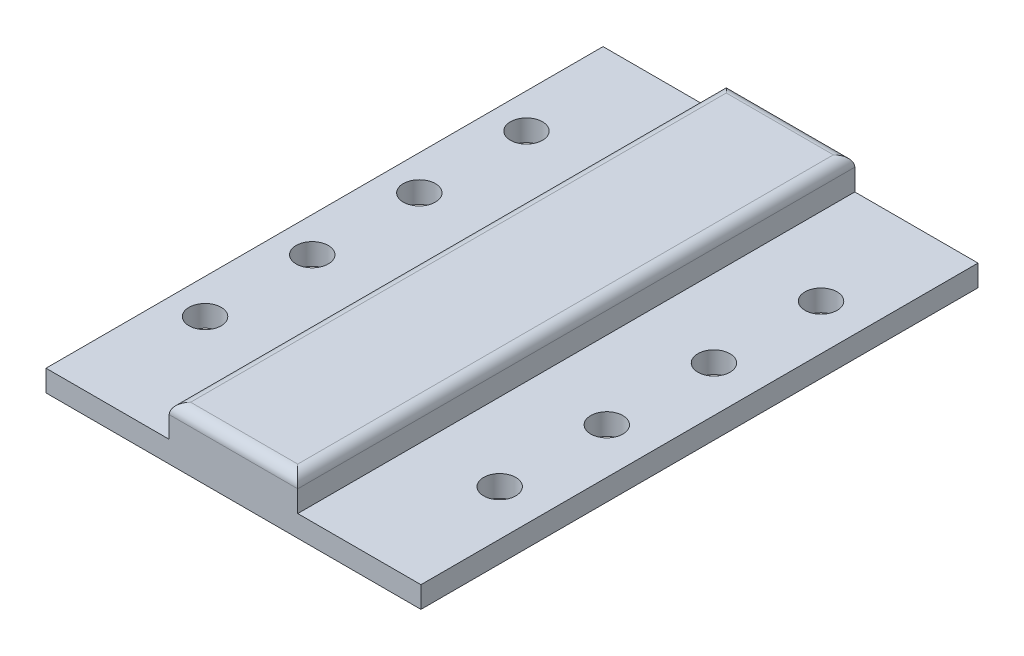
ISO-10303-21;
HEADER;
FILE_DESCRIPTION(('STEP AP214'),'2;1');
FILE_NAME('part.step','',(''),(''),'','','');
FILE_SCHEMA(('AUTOMOTIVE_DESIGN { 1 0 10303 214 1 1 1 1 }'));
ENDSEC;
DATA;
#1=APPLICATION_CONTEXT('core data for automotive mechanical design processes');
#2=APPLICATION_PROTOCOL_DEFINITION('international standard','automotive_design',2000,#1);
#3=PRODUCT_CONTEXT('',#1,'mechanical');
#4=PRODUCT('Part','Part','',(#3));
#5=PRODUCT_RELATED_PRODUCT_CATEGORY('part','',(#4));
#6=PRODUCT_DEFINITION_FORMATION('','',#4);
#7=PRODUCT_DEFINITION_CONTEXT('part definition',#1,'design');
#8=PRODUCT_DEFINITION('design','',#6,#7);
#9=PRODUCT_DEFINITION_SHAPE('','',#8);
#10=(LENGTH_UNIT() NAMED_UNIT(*) SI_UNIT(.MILLI.,.METRE.));
#11=(NAMED_UNIT(*) PLANE_ANGLE_UNIT() SI_UNIT($,.RADIAN.));
#12=(NAMED_UNIT(*) SI_UNIT($,.STERADIAN.) SOLID_ANGLE_UNIT());
#13=UNCERTAINTY_MEASURE_WITH_UNIT(LENGTH_MEASURE(1.E-05),#10,'distance_accuracy_value','');
#14=(GEOMETRIC_REPRESENTATION_CONTEXT(3) GLOBAL_UNCERTAINTY_ASSIGNED_CONTEXT((#13)) GLOBAL_UNIT_ASSIGNED_CONTEXT((#10,
#11,#12)) REPRESENTATION_CONTEXT('',''));
#15=CARTESIAN_POINT('',(0.,0.,0.));
#16=DIRECTION('',(0.,0.,1.));
#17=DIRECTION('',(1.,0.,0.));
#18=AXIS2_PLACEMENT_3D('',#15,#16,#17);
#19=CARTESIAN_POINT('',(0.,2.,0.));
#20=DIRECTION('',(0.,1.,0.));
#21=DIRECTION('',(0.,0.,1.));
#22=AXIS2_PLACEMENT_3D('',#19,#20,#21);
#23=PLANE('',#22);
#24=CARTESIAN_POINT('',(-14.2500000000002,2.,-5.60000000000045));
#25=DIRECTION('',(0.,1.,0.));
#26=DIRECTION('',(0.,0.,1.));
#27=AXIS2_PLACEMENT_3D('',#24,#25,#26);
#28=CIRCLE('',#27,1.50000000000006);
#29=CARTESIAN_POINT('',(-14.2500000000002,2.,-4.10000000000039));
#30=VERTEX_POINT('',#29);
#31=EDGE_CURVE('E273',#30,#30,#28,.T.);
#32=ORIENTED_EDGE('',*,*,#31,.F.);
#33=EDGE_LOOP('',(#32));
#34=FACE_BOUND('',#33,.T.);
#35=CARTESIAN_POINT('',(-14.2500000000003,2.,-15.6000000000005));
#36=DIRECTION('',(0.,1.,0.));
#37=DIRECTION('',(0.,0.,1.));
#38=AXIS2_PLACEMENT_3D('',#35,#36,#37);
#39=CIRCLE('',#38,1.50000000000006);
#40=CARTESIAN_POINT('',(-14.2500000000003,2.,-14.1000000000004));
#41=VERTEX_POINT('',#40);
#42=EDGE_CURVE('E281',#41,#41,#39,.T.);
#43=ORIENTED_EDGE('',*,*,#42,.F.);
#44=EDGE_LOOP('',(#43));
#45=FACE_BOUND('',#44,.T.);
#46=CARTESIAN_POINT('',(-14.25,2.,14.3999999999995));
#47=DIRECTION('',(0.,1.,0.));
#48=DIRECTION('',(0.,0.,1.));
#49=AXIS2_PLACEMENT_3D('',#46,#47,#48);
#50=CIRCLE('',#49,1.50000000000006);
#51=CARTESIAN_POINT('',(-14.25,2.,15.8999999999996));
#52=VERTEX_POINT('',#51);
#53=EDGE_CURVE('E254',#52,#52,#50,.T.);
#54=ORIENTED_EDGE('',*,*,#53,.F.);
#55=EDGE_LOOP('',(#54));
#56=FACE_BOUND('',#55,.T.);
#57=CARTESIAN_POINT('',(-14.2500000000001,2.,4.39999999999955));
#58=DIRECTION('',(0.,1.,0.));
#59=DIRECTION('',(0.,0.,1.));
#60=AXIS2_PLACEMENT_3D('',#57,#58,#59);
#61=CIRCLE('',#60,1.50000000000006);
#62=CARTESIAN_POINT('',(-14.2500000000001,2.,5.89999999999961));
#63=VERTEX_POINT('',#62);
#64=EDGE_CURVE('E266',#63,#63,#61,.T.);
#65=ORIENTED_EDGE('',*,*,#64,.F.);
#66=EDGE_LOOP('',(#65));
#67=FACE_BOUND('',#66,.T.);
#68=DIRECTION('',(1.,0.,0.));
#69=VECTOR('',#68,1.);
#70=CARTESIAN_POINT('',(17.5,2.,26.));
#71=LINE('',#70,#69);
#72=CARTESIAN_POINT('',(-17.5,2.,26.));
#73=VERTEX_POINT('',#72);
#74=CARTESIAN_POINT('',(-6.,2.,26.));
#75=VERTEX_POINT('',#74);
#76=EDGE_CURVE('E157',#73,#75,#71,.T.);
#77=ORIENTED_EDGE('',*,*,#76,.T.);
#78=DIRECTION('',(0.,0.,-1.));
#79=VECTOR('',#78,1.);
#80=CARTESIAN_POINT('',(-6.,2.,38.369316876853));
#81=LINE('',#80,#79);
#82=CARTESIAN_POINT('',(-6.,2.,-26.));
#83=VERTEX_POINT('',#82);
#84=EDGE_CURVE('E138',#75,#83,#81,.T.);
#85=ORIENTED_EDGE('',*,*,#84,.T.);
#86=DIRECTION('',(-1.,0.,0.));
#87=VECTOR('',#86,1.);
#88=CARTESIAN_POINT('',(17.5,2.,-26.));
#89=LINE('',#88,#87);
#90=CARTESIAN_POINT('',(-17.5,2.,-26.));
#91=VERTEX_POINT('',#90);
#92=EDGE_CURVE('E146',#83,#91,#89,.T.);
#93=ORIENTED_EDGE('',*,*,#92,.T.);
#94=DIRECTION('',(0.,0.,1.));
#95=VECTOR('',#94,1.);
#96=CARTESIAN_POINT('',(-17.5,2.,26.));
#97=LINE('',#96,#95);
#98=EDGE_CURVE('E145',#91,#73,#97,.T.);
#99=ORIENTED_EDGE('',*,*,#98,.T.);
#100=EDGE_LOOP('',(#77,#85,#93,#99));
#101=FACE_BOUND('',#100,.T.);
#102=ADVANCED_FACE('F39',(#34,#45,#56,#67,#101),#23,.T.);
#103=CARTESIAN_POINT('',(17.5,2.,26.));
#104=DIRECTION('',(-1.,0.,0.));
#105=DIRECTION('',(0.,0.,1.));
#106=AXIS2_PLACEMENT_3D('',#103,#104,#105);
#107=PLANE('',#106);
#108=DIRECTION('',(0.,0.,-1.));
#109=VECTOR('',#108,1.);
#110=CARTESIAN_POINT('',(17.5,0.,26.));
#111=LINE('',#110,#109);
#112=CARTESIAN_POINT('',(17.5,0.,26.));
#113=VERTEX_POINT('',#112);
#114=CARTESIAN_POINT('',(17.5,0.,-26.));
#115=VERTEX_POINT('',#114);
#116=EDGE_CURVE('E162',#113,#115,#111,.T.);
#117=ORIENTED_EDGE('',*,*,#116,.T.);
#118=DIRECTION('',(0.,-1.,0.));
#119=VECTOR('',#118,1.);
#120=CARTESIAN_POINT('',(17.5,2.,-26.));
#121=LINE('',#120,#119);
#122=CARTESIAN_POINT('',(17.5,2.,-26.));
#123=VERTEX_POINT('',#122);
#124=EDGE_CURVE('E187',#123,#115,#121,.T.);
#125=ORIENTED_EDGE('',*,*,#124,.F.);
#126=DIRECTION('',(0.,0.,-1.));
#127=VECTOR('',#126,1.);
#128=CARTESIAN_POINT('',(17.5,2.,26.));
#129=LINE('',#128,#127);
#130=CARTESIAN_POINT('',(17.5,2.,26.));
#131=VERTEX_POINT('',#130);
#132=EDGE_CURVE('E142',#131,#123,#129,.T.);
#133=ORIENTED_EDGE('',*,*,#132,.F.);
#134=DIRECTION('',(0.,-1.,0.));
#135=VECTOR('',#134,1.);
#136=CARTESIAN_POINT('',(17.5,2.,26.));
#137=LINE('',#136,#135);
#138=EDGE_CURVE('E161',#131,#113,#137,.T.);
#139=ORIENTED_EDGE('',*,*,#138,.T.);
#140=EDGE_LOOP('',(#117,#125,#133,#139));
#141=FACE_BOUND('',#140,.T.);
#142=ADVANCED_FACE('F328',(#141),#107,.F.);
#143=CARTESIAN_POINT('',(17.5,2.,-26.));
#144=DIRECTION('',(0.,0.,1.));
#145=DIRECTION('',(1.,0.,0.));
#146=AXIS2_PLACEMENT_3D('',#143,#144,#145);
#147=PLANE('',#146);
#148=DIRECTION('',(0.,1.,0.));
#149=VECTOR('',#148,1.);
#150=CARTESIAN_POINT('',(-6.,2.,-26.));
#151=LINE('',#150,#149);
#152=CARTESIAN_POINT('',(-6.,4.,-26.));
#153=VERTEX_POINT('',#152);
#154=EDGE_CURVE('E128',#83,#153,#151,.T.);
#155=ORIENTED_EDGE('',*,*,#154,.T.);
#156=DIRECTION('',(1.,0.,0.));
#157=VECTOR('',#156,1.);
#158=CARTESIAN_POINT('',(17.5,4.,-26.));
#159=LINE('',#158,#157);
#160=CARTESIAN_POINT('',(6.,4.,-26.));
#161=VERTEX_POINT('',#160);
#162=EDGE_CURVE('E126',#153,#161,#159,.T.);
#163=ORIENTED_EDGE('',*,*,#162,.T.);
#164=DIRECTION('',(0.,-1.,0.));
#165=VECTOR('',#164,1.);
#166=CARTESIAN_POINT('',(6.,2.,-26.));
#167=LINE('',#166,#165);
#168=CARTESIAN_POINT('',(6.,2.,-26.));
#169=VERTEX_POINT('',#168);
#170=EDGE_CURVE('E117',#161,#169,#167,.T.);
#171=ORIENTED_EDGE('',*,*,#170,.T.);
#172=EDGE_CURVE('E123',#123,#169,#89,.T.);
#173=ORIENTED_EDGE('',*,*,#172,.F.);
#174=ORIENTED_EDGE('',*,*,#124,.T.);
#175=DIRECTION('',(-1.,0.,0.));
#176=VECTOR('',#175,1.);
#177=CARTESIAN_POINT('',(17.5,0.,-26.));
#178=LINE('',#177,#176);
#179=CARTESIAN_POINT('',(-17.5,0.,-26.));
#180=VERTEX_POINT('',#179);
#181=EDGE_CURVE('E166',#115,#180,#178,.T.);
#182=ORIENTED_EDGE('',*,*,#181,.T.);
#183=DIRECTION('',(0.,-1.,0.));
#184=VECTOR('',#183,1.);
#185=CARTESIAN_POINT('',(-17.5,2.,-26.));
#186=LINE('',#185,#184);
#187=EDGE_CURVE('E183',#91,#180,#186,.T.);
#188=ORIENTED_EDGE('',*,*,#187,.F.);
#189=ORIENTED_EDGE('',*,*,#92,.F.);
#190=EDGE_LOOP('',(#155,#163,#171,#173,#174,#182,#188,#189));
#191=FACE_BOUND('',#190,.T.);
#192=ADVANCED_FACE('F120',(#191),#147,.F.);
#193=CARTESIAN_POINT('',(-17.5,2.,26.));
#194=DIRECTION('',(1.,0.,0.));
#195=DIRECTION('',(0.,0.,-1.));
#196=AXIS2_PLACEMENT_3D('',#193,#194,#195);
#197=PLANE('',#196);
#198=DIRECTION('',(0.,0.,1.));
#199=VECTOR('',#198,1.);
#200=CARTESIAN_POINT('',(-17.5,0.,26.));
#201=LINE('',#200,#199);
#202=CARTESIAN_POINT('',(-17.5,0.,26.));
#203=VERTEX_POINT('',#202);
#204=EDGE_CURVE('E170',#180,#203,#201,.T.);
#205=ORIENTED_EDGE('',*,*,#204,.T.);
#206=DIRECTION('',(0.,-1.,0.));
#207=VECTOR('',#206,1.);
#208=CARTESIAN_POINT('',(-17.5,2.,26.));
#209=LINE('',#208,#207);
#210=EDGE_CURVE('E179',#73,#203,#209,.T.);
#211=ORIENTED_EDGE('',*,*,#210,.F.);
#212=ORIENTED_EDGE('',*,*,#98,.F.);
#213=ORIENTED_EDGE('',*,*,#187,.T.);
#214=EDGE_LOOP('',(#205,#211,#212,#213));
#215=FACE_BOUND('',#214,.T.);
#216=ADVANCED_FACE('F308',(#215),#197,.F.);
#217=CARTESIAN_POINT('',(17.5,2.,26.));
#218=DIRECTION('',(0.,0.,-1.));
#219=DIRECTION('',(-1.,0.,0.));
#220=AXIS2_PLACEMENT_3D('',#217,#218,#219);
#221=PLANE('',#220);
#222=DIRECTION('',(0.,-1.,0.));
#223=VECTOR('',#222,1.);
#224=CARTESIAN_POINT('',(6.,2.,26.));
#225=LINE('',#224,#223);
#226=CARTESIAN_POINT('',(6.,4.,26.));
#227=VERTEX_POINT('',#226);
#228=CARTESIAN_POINT('',(6.,2.,26.));
#229=VERTEX_POINT('',#228);
#230=EDGE_CURVE('E134',#227,#229,#225,.T.);
#231=ORIENTED_EDGE('',*,*,#230,.F.);
#232=DIRECTION('',(1.,0.,0.));
#233=VECTOR('',#232,1.);
#234=CARTESIAN_POINT('',(17.5,4.,26.));
#235=LINE('',#234,#233);
#236=CARTESIAN_POINT('',(-6.,4.,26.));
#237=VERTEX_POINT('',#236);
#238=EDGE_CURVE('E57',#227,#237,#235,.F.);
#239=ORIENTED_EDGE('',*,*,#238,.T.);
#240=DIRECTION('',(0.,1.,0.));
#241=VECTOR('',#240,1.);
#242=CARTESIAN_POINT('',(-6.,2.,26.));
#243=LINE('',#242,#241);
#244=EDGE_CURVE('E167',#75,#237,#243,.T.);
#245=ORIENTED_EDGE('',*,*,#244,.F.);
#246=ORIENTED_EDGE('',*,*,#76,.F.);
#247=ORIENTED_EDGE('',*,*,#210,.T.);
#248=DIRECTION('',(1.,0.,0.));
#249=VECTOR('',#248,1.);
#250=CARTESIAN_POINT('',(17.5,0.,26.));
#251=LINE('',#250,#249);
#252=EDGE_CURVE('E173',#203,#113,#251,.T.);
#253=ORIENTED_EDGE('',*,*,#252,.T.);
#254=ORIENTED_EDGE('',*,*,#138,.F.);
#255=EDGE_CURVE('E151',#229,#131,#71,.T.);
#256=ORIENTED_EDGE('',*,*,#255,.F.);
#257=EDGE_LOOP('',(#231,#239,#245,#246,#247,#253,#254,#256));
#258=FACE_BOUND('',#257,.T.);
#259=ADVANCED_FACE('F310',(#258),#221,.F.);
#260=CARTESIAN_POINT('',(13.2499999999999,2.,4.39999999999955));
#261=DIRECTION('',(0.,1.,0.));
#262=DIRECTION('',(0.,0.,1.));
#263=AXIS2_PLACEMENT_3D('',#260,#261,#262);
#264=CIRCLE('',#263,1.49999999999994);
#265=CARTESIAN_POINT('',(13.2499999999999,2.,5.89999999999949));
#266=VERTEX_POINT('',#265);
#267=EDGE_CURVE('E271',#266,#266,#264,.T.);
#268=ORIENTED_EDGE('',*,*,#267,.F.);
#269=EDGE_LOOP('',(#268));
#270=FACE_BOUND('',#269,.T.);
#271=CARTESIAN_POINT('',(13.2499999999998,2.,-5.60000000000045));
#272=DIRECTION('',(0.,1.,0.));
#273=DIRECTION('',(0.,0.,1.));
#274=AXIS2_PLACEMENT_3D('',#271,#272,#273);
#275=CIRCLE('',#274,1.49999999999994);
#276=CARTESIAN_POINT('',(13.2499999999998,2.,-4.10000000000051));
#277=VERTEX_POINT('',#276);
#278=EDGE_CURVE('E277',#277,#277,#275,.T.);
#279=ORIENTED_EDGE('',*,*,#278,.F.);
#280=EDGE_LOOP('',(#279));
#281=FACE_BOUND('',#280,.T.);
#282=CARTESIAN_POINT('',(13.25,2.,14.3999999999995));
#283=DIRECTION('',(0.,1.,0.));
#284=DIRECTION('',(0.,0.,1.));
#285=AXIS2_PLACEMENT_3D('',#282,#283,#284);
#286=CIRCLE('',#285,1.49999999999994);
#287=CARTESIAN_POINT('',(13.25,2.,15.8999999999995));
#288=VERTEX_POINT('',#287);
#289=EDGE_CURVE('E260',#288,#288,#286,.T.);
#290=ORIENTED_EDGE('',*,*,#289,.F.);
#291=EDGE_LOOP('',(#290));
#292=FACE_BOUND('',#291,.T.);
#293=CARTESIAN_POINT('',(13.2499999999997,2.,-15.6000000000005));
#294=DIRECTION('',(0.,1.,0.));
#295=DIRECTION('',(0.,0.,1.));
#296=AXIS2_PLACEMENT_3D('',#293,#294,#295);
#297=CIRCLE('',#296,1.49999999999994);
#298=CARTESIAN_POINT('',(13.2499999999997,2.,-14.1000000000005));
#299=VERTEX_POINT('',#298);
#300=EDGE_CURVE('E195',#299,#299,#297,.T.);
#301=ORIENTED_EDGE('',*,*,#300,.F.);
#302=EDGE_LOOP('',(#301));
#303=FACE_BOUND('',#302,.T.);
#304=DIRECTION('',(0.,0.,-1.));
#305=VECTOR('',#304,1.);
#306=CARTESIAN_POINT('',(6.,2.,38.369316876853));
#307=LINE('',#306,#305);
#308=EDGE_CURVE('E132',#229,#169,#307,.T.);
#309=ORIENTED_EDGE('',*,*,#308,.F.);
#310=ORIENTED_EDGE('',*,*,#255,.T.);
#311=ORIENTED_EDGE('',*,*,#132,.T.);
#312=ORIENTED_EDGE('',*,*,#172,.T.);
#313=EDGE_LOOP('',(#309,#310,#311,#312));
#314=FACE_BOUND('',#313,.T.);
#315=ADVANCED_FACE('F140',(#270,#281,#292,#303,#314),#23,.T.);
#316=CARTESIAN_POINT('',(0.,0.,0.));
#317=DIRECTION('',(0.,1.,0.));
#318=DIRECTION('',(0.,0.,1.));
#319=AXIS2_PLACEMENT_3D('',#316,#317,#318);
#320=PLANE('',#319);
#321=CARTESIAN_POINT('',(13.2499999999999,0.,4.39999999999955));
#322=DIRECTION('',(0.,1.,0.));
#323=DIRECTION('',(0.,0.,1.));
#324=AXIS2_PLACEMENT_3D('',#321,#322,#323);
#325=CIRCLE('',#324,1.49999999999994);
#326=CARTESIAN_POINT('',(13.2499999999999,0.,5.89999999999949));
#327=VERTEX_POINT('',#326);
#328=EDGE_CURVE('E129',#327,#327,#325,.T.);
#329=ORIENTED_EDGE('',*,*,#328,.T.);
#330=EDGE_LOOP('',(#329));
#331=FACE_BOUND('',#330,.T.);
#332=CARTESIAN_POINT('',(-14.2500000000002,0.,-5.60000000000045));
#333=DIRECTION('',(0.,1.,0.));
#334=DIRECTION('',(0.,0.,1.));
#335=AXIS2_PLACEMENT_3D('',#332,#333,#334);
#336=CIRCLE('',#335,1.50000000000006);
#337=CARTESIAN_POINT('',(-14.2500000000002,0.,-4.10000000000039));
#338=VERTEX_POINT('',#337);
#339=EDGE_CURVE('E215',#338,#338,#336,.T.);
#340=ORIENTED_EDGE('',*,*,#339,.T.);
#341=EDGE_LOOP('',(#340));
#342=FACE_BOUND('',#341,.T.);
#343=CARTESIAN_POINT('',(13.2499999999998,0.,-5.60000000000045));
#344=DIRECTION('',(0.,1.,0.));
#345=DIRECTION('',(0.,0.,1.));
#346=AXIS2_PLACEMENT_3D('',#343,#344,#345);
#347=CIRCLE('',#346,1.49999999999994);
#348=CARTESIAN_POINT('',(13.2499999999998,0.,-4.10000000000051));
#349=VERTEX_POINT('',#348);
#350=EDGE_CURVE('E211',#349,#349,#347,.T.);
#351=ORIENTED_EDGE('',*,*,#350,.T.);
#352=EDGE_LOOP('',(#351));
#353=FACE_BOUND('',#352,.T.);
#354=CARTESIAN_POINT('',(-14.2500000000003,0.,-15.6000000000005));
#355=DIRECTION('',(0.,1.,0.));
#356=DIRECTION('',(0.,0.,1.));
#357=AXIS2_PLACEMENT_3D('',#354,#355,#356);
#358=CIRCLE('',#357,1.50000000000006);
#359=CARTESIAN_POINT('',(-14.2500000000003,0.,-14.1000000000004));
#360=VERTEX_POINT('',#359);
#361=EDGE_CURVE('E207',#360,#360,#358,.T.);
#362=ORIENTED_EDGE('',*,*,#361,.T.);
#363=EDGE_LOOP('',(#362));
#364=FACE_BOUND('',#363,.T.);
#365=CARTESIAN_POINT('',(-14.25,0.,14.3999999999995));
#366=DIRECTION('',(0.,1.,0.));
#367=DIRECTION('',(0.,0.,1.));
#368=AXIS2_PLACEMENT_3D('',#365,#366,#367);
#369=CIRCLE('',#368,1.50000000000006);
#370=CARTESIAN_POINT('',(-14.25,0.,15.8999999999996));
#371=VERTEX_POINT('',#370);
#372=EDGE_CURVE('E203',#371,#371,#369,.T.);
#373=ORIENTED_EDGE('',*,*,#372,.T.);
#374=EDGE_LOOP('',(#373));
#375=FACE_BOUND('',#374,.T.);
#376=CARTESIAN_POINT('',(13.25,0.,14.3999999999995));
#377=DIRECTION('',(0.,1.,0.));
#378=DIRECTION('',(0.,0.,1.));
#379=AXIS2_PLACEMENT_3D('',#376,#377,#378);
#380=CIRCLE('',#379,1.49999999999994);
#381=CARTESIAN_POINT('',(13.25,0.,15.8999999999995));
#382=VERTEX_POINT('',#381);
#383=EDGE_CURVE('E199',#382,#382,#380,.T.);
#384=ORIENTED_EDGE('',*,*,#383,.T.);
#385=EDGE_LOOP('',(#384));
#386=FACE_BOUND('',#385,.T.);
#387=CARTESIAN_POINT('',(-14.2500000000001,0.,4.39999999999955));
#388=DIRECTION('',(0.,1.,0.));
#389=DIRECTION('',(0.,0.,1.));
#390=AXIS2_PLACEMENT_3D('',#387,#388,#389);
#391=CIRCLE('',#390,1.50000000000006);
#392=CARTESIAN_POINT('',(-14.2500000000001,0.,5.89999999999961));
#393=VERTEX_POINT('',#392);
#394=EDGE_CURVE('E194',#393,#393,#391,.T.);
#395=ORIENTED_EDGE('',*,*,#394,.T.);
#396=EDGE_LOOP('',(#395));
#397=FACE_BOUND('',#396,.T.);
#398=CARTESIAN_POINT('',(13.2499999999997,0.,-15.6000000000005));
#399=DIRECTION('',(0.,1.,0.));
#400=DIRECTION('',(0.,0.,1.));
#401=AXIS2_PLACEMENT_3D('',#398,#399,#400);
#402=CIRCLE('',#401,1.49999999999994);
#403=CARTESIAN_POINT('',(13.2499999999997,0.,-14.1000000000005));
#404=VERTEX_POINT('',#403);
#405=EDGE_CURVE('E190',#404,#404,#402,.T.);
#406=ORIENTED_EDGE('',*,*,#405,.T.);
#407=EDGE_LOOP('',(#406));
#408=FACE_BOUND('',#407,.T.);
#409=ORIENTED_EDGE('',*,*,#116,.F.);
#410=ORIENTED_EDGE('',*,*,#252,.F.);
#411=ORIENTED_EDGE('',*,*,#204,.F.);
#412=ORIENTED_EDGE('',*,*,#181,.F.);
#413=EDGE_LOOP('',(#409,#410,#411,#412));
#414=FACE_BOUND('',#413,.T.);
#415=ADVANCED_FACE('F340',(#331,#342,#353,#364,#375,#386,#397,#408,#414),#320,.F.);
#416=CARTESIAN_POINT('',(-6.,5.,38.369316876853));
#417=DIRECTION('',(0.,-1.,0.));
#418=DIRECTION('',(1.,0.,0.));
#419=AXIS2_PLACEMENT_3D('',#416,#417,#418);
#420=PLANE('',#419);
#421=DIRECTION('',(1.,0.,0.));
#422=VECTOR('',#421,1.);
#423=CARTESIAN_POINT('',(-6.,5.,-25.));
#424=LINE('',#423,#422);
#425=CARTESIAN_POINT('',(5.,5.,-25.));
#426=VERTEX_POINT('',#425);
#427=CARTESIAN_POINT('',(-5.,5.,-25.));
#428=VERTEX_POINT('',#427);
#429=EDGE_CURVE('E230',#426,#428,#424,.F.);
#430=ORIENTED_EDGE('',*,*,#429,.T.);
#431=DIRECTION('',(0.,0.,-1.));
#432=VECTOR('',#431,1.);
#433=CARTESIAN_POINT('',(-5.,5.,38.369316876853));
#434=LINE('',#433,#432);
#435=CARTESIAN_POINT('',(-5.,5.,25.));
#436=VERTEX_POINT('',#435);
#437=EDGE_CURVE('E234',#428,#436,#434,.F.);
#438=ORIENTED_EDGE('',*,*,#437,.T.);
#439=DIRECTION('',(1.,0.,0.));
#440=VECTOR('',#439,1.);
#441=CARTESIAN_POINT('',(-6.,5.,25.));
#442=LINE('',#441,#440);
#443=CARTESIAN_POINT('',(5.,5.,25.));
#444=VERTEX_POINT('',#443);
#445=EDGE_CURVE('E227',#436,#444,#442,.T.);
#446=ORIENTED_EDGE('',*,*,#445,.T.);
#447=DIRECTION('',(0.,0.,-1.));
#448=VECTOR('',#447,1.);
#449=CARTESIAN_POINT('',(5.,5.,38.369316876853));
#450=LINE('',#449,#448);
#451=EDGE_CURVE('E224',#444,#426,#450,.T.);
#452=ORIENTED_EDGE('',*,*,#451,.T.);
#453=EDGE_LOOP('',(#430,#438,#446,#452));
#454=FACE_BOUND('',#453,.T.);
#455=ADVANCED_FACE('F345',(#454),#420,.F.);
#456=CARTESIAN_POINT('',(6.,2.,38.369316876853));
#457=DIRECTION('',(-1.,0.,0.));
#458=DIRECTION('',(0.,0.,1.));
#459=AXIS2_PLACEMENT_3D('',#456,#457,#458);
#460=PLANE('',#459);
#461=ORIENTED_EDGE('',*,*,#170,.F.);
#462=DIRECTION('',(0.,0.,-1.));
#463=VECTOR('',#462,1.);
#464=CARTESIAN_POINT('',(6.,4.,38.369316876853));
#465=LINE('',#464,#463);
#466=EDGE_CURVE('E12',#161,#227,#465,.F.);
#467=ORIENTED_EDGE('',*,*,#466,.T.);
#468=ORIENTED_EDGE('',*,*,#230,.T.);
#469=ORIENTED_EDGE('',*,*,#308,.T.);
#470=EDGE_LOOP('',(#461,#467,#468,#469));
#471=FACE_BOUND('',#470,.T.);
#472=ADVANCED_FACE('F133',(#471),#460,.F.);
#473=CARTESIAN_POINT('',(-6.,2.,38.369316876853));
#474=DIRECTION('',(1.,0.,0.));
#475=DIRECTION('',(0.,0.,-1.));
#476=AXIS2_PLACEMENT_3D('',#473,#474,#475);
#477=PLANE('',#476);
#478=ORIENTED_EDGE('',*,*,#244,.T.);
#479=DIRECTION('',(0.,0.,-1.));
#480=VECTOR('',#479,1.);
#481=CARTESIAN_POINT('',(-6.,4.,38.369316876853));
#482=LINE('',#481,#480);
#483=EDGE_CURVE('E49',#237,#153,#482,.T.);
#484=ORIENTED_EDGE('',*,*,#483,.T.);
#485=ORIENTED_EDGE('',*,*,#154,.F.);
#486=ORIENTED_EDGE('',*,*,#84,.F.);
#487=EDGE_LOOP('',(#478,#484,#485,#486));
#488=FACE_BOUND('',#487,.T.);
#489=ADVANCED_FACE('F311',(#488),#477,.F.);
#490=CARTESIAN_POINT('',(13.2499999999997,-8.,-15.6000000000005));
#491=DIRECTION('',(0.,1.,0.));
#492=DIRECTION('',(0.,0.,1.));
#493=AXIS2_PLACEMENT_3D('',#490,#491,#492);
#494=CYLINDRICAL_SURFACE('',#493,1.49999999999994);
#495=ORIENTED_EDGE('',*,*,#300,.T.);
#496=EDGE_LOOP('',(#495));
#497=FACE_BOUND('',#496,.T.);
#498=ORIENTED_EDGE('',*,*,#405,.F.);
#499=EDGE_LOOP('',(#498));
#500=FACE_BOUND('',#499,.T.);
#501=ADVANCED_FACE('F356',(#497,#500),#494,.F.);
#502=CARTESIAN_POINT('',(-14.2500000000001,-8.,4.39999999999955));
#503=DIRECTION('',(0.,1.,0.));
#504=DIRECTION('',(0.,0.,1.));
#505=AXIS2_PLACEMENT_3D('',#502,#503,#504);
#506=CYLINDRICAL_SURFACE('',#505,1.50000000000006);
#507=ORIENTED_EDGE('',*,*,#64,.T.);
#508=EDGE_LOOP('',(#507));
#509=FACE_BOUND('',#508,.T.);
#510=ORIENTED_EDGE('',*,*,#394,.F.);
#511=EDGE_LOOP('',(#510));
#512=FACE_BOUND('',#511,.T.);
#513=ADVANCED_FACE('F359',(#509,#512),#506,.F.);
#514=CARTESIAN_POINT('',(13.25,-8.,14.3999999999995));
#515=DIRECTION('',(0.,1.,0.));
#516=DIRECTION('',(0.,0.,1.));
#517=AXIS2_PLACEMENT_3D('',#514,#515,#516);
#518=CYLINDRICAL_SURFACE('',#517,1.49999999999994);
#519=ORIENTED_EDGE('',*,*,#289,.T.);
#520=EDGE_LOOP('',(#519));
#521=FACE_BOUND('',#520,.T.);
#522=ORIENTED_EDGE('',*,*,#383,.F.);
#523=EDGE_LOOP('',(#522));
#524=FACE_BOUND('',#523,.T.);
#525=ADVANCED_FACE('F372',(#521,#524),#518,.F.);
#526=CARTESIAN_POINT('',(-14.25,-8.,14.3999999999995));
#527=DIRECTION('',(0.,1.,0.));
#528=DIRECTION('',(0.,0.,1.));
#529=AXIS2_PLACEMENT_3D('',#526,#527,#528);
#530=CYLINDRICAL_SURFACE('',#529,1.50000000000006);
#531=ORIENTED_EDGE('',*,*,#53,.T.);
#532=EDGE_LOOP('',(#531));
#533=FACE_BOUND('',#532,.T.);
#534=ORIENTED_EDGE('',*,*,#372,.F.);
#535=EDGE_LOOP('',(#534));
#536=FACE_BOUND('',#535,.T.);
#537=ADVANCED_FACE('F404',(#533,#536),#530,.F.);
#538=CARTESIAN_POINT('',(-14.2500000000003,-8.,-15.6000000000005));
#539=DIRECTION('',(0.,1.,0.));
#540=DIRECTION('',(0.,0.,1.));
#541=AXIS2_PLACEMENT_3D('',#538,#539,#540);
#542=CYLINDRICAL_SURFACE('',#541,1.50000000000006);
#543=ORIENTED_EDGE('',*,*,#42,.T.);
#544=EDGE_LOOP('',(#543));
#545=FACE_BOUND('',#544,.T.);
#546=ORIENTED_EDGE('',*,*,#361,.F.);
#547=EDGE_LOOP('',(#546));
#548=FACE_BOUND('',#547,.T.);
#549=ADVANCED_FACE('F413',(#545,#548),#542,.F.);
#550=CARTESIAN_POINT('',(13.2499999999998,-8.,-5.60000000000045));
#551=DIRECTION('',(0.,1.,0.));
#552=DIRECTION('',(0.,0.,1.));
#553=AXIS2_PLACEMENT_3D('',#550,#551,#552);
#554=CYLINDRICAL_SURFACE('',#553,1.49999999999994);
#555=ORIENTED_EDGE('',*,*,#278,.T.);
#556=EDGE_LOOP('',(#555));
#557=FACE_BOUND('',#556,.T.);
#558=ORIENTED_EDGE('',*,*,#350,.F.);
#559=EDGE_LOOP('',(#558));
#560=FACE_BOUND('',#559,.T.);
#561=ADVANCED_FACE('F378',(#557,#560),#554,.F.);
#562=CARTESIAN_POINT('',(-14.2500000000002,-8.,-5.60000000000045));
#563=DIRECTION('',(0.,1.,0.));
#564=DIRECTION('',(0.,0.,1.));
#565=AXIS2_PLACEMENT_3D('',#562,#563,#564);
#566=CYLINDRICAL_SURFACE('',#565,1.50000000000006);
#567=ORIENTED_EDGE('',*,*,#31,.T.);
#568=EDGE_LOOP('',(#567));
#569=FACE_BOUND('',#568,.T.);
#570=ORIENTED_EDGE('',*,*,#339,.F.);
#571=EDGE_LOOP('',(#570));
#572=FACE_BOUND('',#571,.T.);
#573=ADVANCED_FACE('F428',(#569,#572),#566,.F.);
#574=CARTESIAN_POINT('',(13.2499999999999,-8.,4.39999999999955));
#575=DIRECTION('',(0.,1.,0.));
#576=DIRECTION('',(0.,0.,1.));
#577=AXIS2_PLACEMENT_3D('',#574,#575,#576);
#578=CYLINDRICAL_SURFACE('',#577,1.49999999999994);
#579=ORIENTED_EDGE('',*,*,#267,.T.);
#580=EDGE_LOOP('',(#579));
#581=FACE_BOUND('',#580,.T.);
#582=ORIENTED_EDGE('',*,*,#328,.F.);
#583=EDGE_LOOP('',(#582));
#584=FACE_BOUND('',#583,.T.);
#585=ADVANCED_FACE('F436',(#581,#584),#578,.F.);
#586=CARTESIAN_POINT('',(-6.,4.,25.));
#587=DIRECTION('',(1.,0.,0.));
#588=DIRECTION('',(0.,1.,0.));
#589=AXIS2_PLACEMENT_3D('',#586,#587,#588);
#590=CYLINDRICAL_SURFACE('',#589,1.);
#591=CARTESIAN_POINT('',(5.,4.,25.));
#592=DIRECTION('',(0.707106781186547,0.,-0.707106781186547));
#593=DIRECTION('',(-0.707106781186547,0.,-0.707106781186547));
#594=AXIS2_PLACEMENT_3D('',#591,#592,#593);
#595=ELLIPSE('',#594,1.41421356237309,1.);
#596=EDGE_CURVE('E246',#444,#227,#595,.T.);
#597=ORIENTED_EDGE('',*,*,#596,.F.);
#598=ORIENTED_EDGE('',*,*,#445,.F.);
#599=CARTESIAN_POINT('',(-5.,4.,25.));
#600=DIRECTION('',(-0.707106781186547,0.,-0.707106781186547));
#601=DIRECTION('',(0.707106781186547,0.,-0.707106781186547));
#602=AXIS2_PLACEMENT_3D('',#599,#600,#601);
#603=ELLIPSE('',#602,1.41421356237309,1.);
#604=EDGE_CURVE('E43',#237,#436,#603,.T.);
#605=ORIENTED_EDGE('',*,*,#604,.F.);
#606=ORIENTED_EDGE('',*,*,#238,.F.);
#607=EDGE_LOOP('',(#597,#598,#605,#606));
#608=FACE_BOUND('',#607,.T.);
#609=ADVANCED_FACE('F41',(#608),#590,.T.);
#610=CARTESIAN_POINT('',(-5.,4.,38.369316876853));
#611=DIRECTION('',(0.,0.,-1.));
#612=DIRECTION('',(-1.,0.,0.));
#613=AXIS2_PLACEMENT_3D('',#610,#611,#612);
#614=CYLINDRICAL_SURFACE('',#613,1.);
#615=ORIENTED_EDGE('',*,*,#604,.T.);
#616=ORIENTED_EDGE('',*,*,#437,.F.);
#617=CARTESIAN_POINT('',(-5.,4.,-25.));
#618=DIRECTION('',(0.707106781186547,0.,-0.707106781186547));
#619=DIRECTION('',(-0.707106781186547,0.,-0.707106781186547));
#620=AXIS2_PLACEMENT_3D('',#617,#618,#619);
#621=ELLIPSE('',#620,1.41421356237309,1.);
#622=EDGE_CURVE('E244',#153,#428,#621,.T.);
#623=ORIENTED_EDGE('',*,*,#622,.F.);
#624=ORIENTED_EDGE('',*,*,#483,.F.);
#625=EDGE_LOOP('',(#615,#616,#623,#624));
#626=FACE_BOUND('',#625,.T.);
#627=ADVANCED_FACE('F314',(#626),#614,.T.);
#628=CARTESIAN_POINT('',(5.,4.,38.369316876853));
#629=DIRECTION('',(0.,0.,-1.));
#630=DIRECTION('',(-1.,0.,0.));
#631=AXIS2_PLACEMENT_3D('',#628,#629,#630);
#632=CYLINDRICAL_SURFACE('',#631,1.);
#633=ORIENTED_EDGE('',*,*,#596,.T.);
#634=ORIENTED_EDGE('',*,*,#466,.F.);
#635=CARTESIAN_POINT('',(5.,4.,-25.));
#636=DIRECTION('',(-0.707106781186547,0.,-0.707106781186547));
#637=DIRECTION('',(0.707106781186547,0.,-0.707106781186547));
#638=AXIS2_PLACEMENT_3D('',#635,#636,#637);
#639=ELLIPSE('',#638,1.41421356237309,1.);
#640=EDGE_CURVE('E241',#426,#161,#639,.T.);
#641=ORIENTED_EDGE('',*,*,#640,.F.);
#642=ORIENTED_EDGE('',*,*,#451,.F.);
#643=EDGE_LOOP('',(#633,#634,#641,#642));
#644=FACE_BOUND('',#643,.T.);
#645=ADVANCED_FACE('F319',(#644),#632,.T.);
#646=CARTESIAN_POINT('',(17.5,4.,-25.));
#647=DIRECTION('',(1.,0.,0.));
#648=DIRECTION('',(0.,1.,0.));
#649=AXIS2_PLACEMENT_3D('',#646,#647,#648);
#650=CYLINDRICAL_SURFACE('',#649,1.);
#651=ORIENTED_EDGE('',*,*,#622,.T.);
#652=ORIENTED_EDGE('',*,*,#429,.F.);
#653=ORIENTED_EDGE('',*,*,#640,.T.);
#654=ORIENTED_EDGE('',*,*,#162,.F.);
#655=EDGE_LOOP('',(#651,#652,#653,#654));
#656=FACE_BOUND('',#655,.T.);
#657=ADVANCED_FACE('F317',(#656),#650,.T.);
#658=CLOSED_SHELL('',(#102,#142,#192,#216,#259,#315,#415,#455,#472,#489,#501,#513,#525,#537,
#549,#561,#573,#585,#609,#627,#645,#657));
#659=MANIFOLD_SOLID_BREP('B2',#658);
#660=ADVANCED_BREP_SHAPE_REPRESENTATION('',(#18,#659),#14);
#661=SHAPE_DEFINITION_REPRESENTATION(#9,#660);
ENDSEC;
END-ISO-10303-21;
